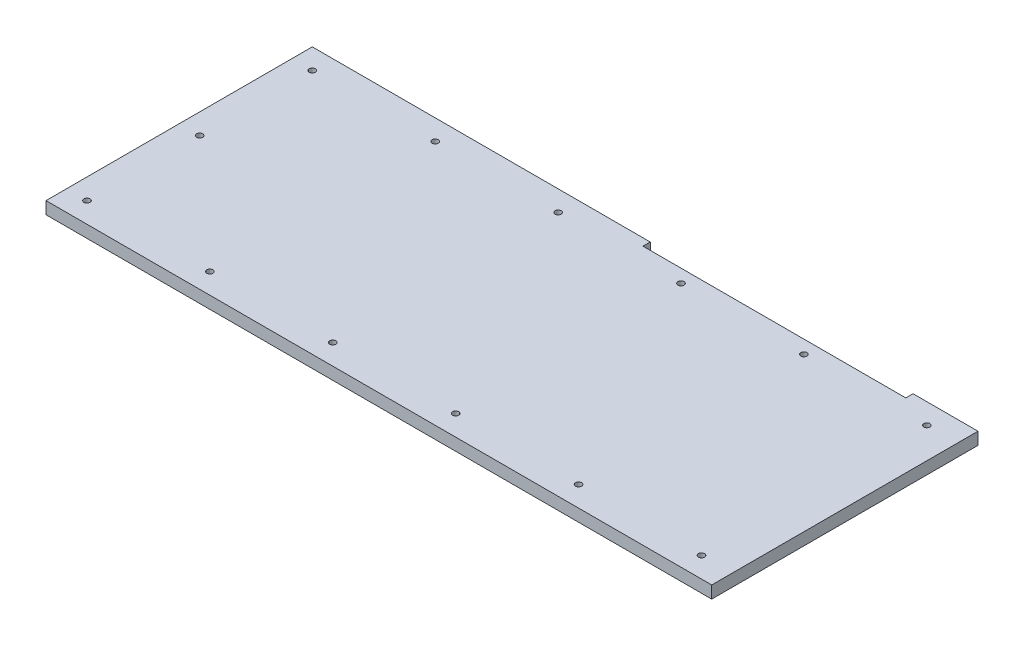
ISO-10303-21;
HEADER;
FILE_DESCRIPTION(('STEP AP214'),'2;1');
FILE_NAME('part.step','',(''),(''),'','','');
FILE_SCHEMA(('AUTOMOTIVE_DESIGN { 1 0 10303 214 1 1 1 1 }'));
ENDSEC;
DATA;
#1=APPLICATION_CONTEXT('core data for automotive mechanical design processes');
#2=APPLICATION_PROTOCOL_DEFINITION('international standard','automotive_design',2000,#1);
#3=PRODUCT_CONTEXT('',#1,'mechanical');
#4=PRODUCT('Part','Part','',(#3));
#5=PRODUCT_RELATED_PRODUCT_CATEGORY('part','',(#4));
#6=PRODUCT_DEFINITION_FORMATION('','',#4);
#7=PRODUCT_DEFINITION_CONTEXT('part definition',#1,'design');
#8=PRODUCT_DEFINITION('design','',#6,#7);
#9=PRODUCT_DEFINITION_SHAPE('','',#8);
#10=(LENGTH_UNIT() NAMED_UNIT(*) SI_UNIT(.MILLI.,.METRE.));
#11=(NAMED_UNIT(*) PLANE_ANGLE_UNIT() SI_UNIT($,.RADIAN.));
#12=(NAMED_UNIT(*) SI_UNIT($,.STERADIAN.) SOLID_ANGLE_UNIT());
#13=UNCERTAINTY_MEASURE_WITH_UNIT(LENGTH_MEASURE(1.E-05),#10,'distance_accuracy_value','');
#14=(GEOMETRIC_REPRESENTATION_CONTEXT(3) GLOBAL_UNCERTAINTY_ASSIGNED_CONTEXT((#13)) GLOBAL_UNIT_ASSIGNED_CONTEXT((#10,
#11,#12)) REPRESENTATION_CONTEXT('',''));
#15=CARTESIAN_POINT('',(0.,0.,0.));
#16=DIRECTION('',(0.,0.,1.));
#17=DIRECTION('',(1.,0.,0.));
#18=AXIS2_PLACEMENT_3D('',#15,#16,#17);
#19=CARTESIAN_POINT('',(0.,6.,0.));
#20=DIRECTION('',(0.,1.,0.));
#21=DIRECTION('',(0.,0.,1.));
#22=AXIS2_PLACEMENT_3D('',#19,#20,#21);
#23=PLANE('',#22);
#24=CARTESIAN_POINT('',(87.5,6.,55.));
#25=DIRECTION('',(0.,1.,0.));
#26=DIRECTION('',(0.,0.,1.));
#27=AXIS2_PLACEMENT_3D('',#24,#25,#26);
#28=CIRCLE('',#27,1.5);
#29=CARTESIAN_POINT('',(87.5,6.,56.5));
#30=VERTEX_POINT('',#29);
#31=EDGE_CURVE('E244',#30,#30,#28,.T.);
#32=ORIENTED_EDGE('',*,*,#31,.F.);
#33=EDGE_LOOP('',(#32));
#34=FACE_BOUND('',#33,.T.);
#35=CARTESIAN_POINT('',(-32.5,6.,55.));
#36=DIRECTION('',(0.,1.,0.));
#37=DIRECTION('',(0.,0.,1.));
#38=AXIS2_PLACEMENT_3D('',#35,#36,#37);
#39=CIRCLE('',#38,1.5);
#40=CARTESIAN_POINT('',(-32.5,6.,56.5));
#41=VERTEX_POINT('',#40);
#42=EDGE_CURVE('E232',#41,#41,#39,.T.);
#43=ORIENTED_EDGE('',*,*,#42,.F.);
#44=EDGE_LOOP('',(#43));
#45=FACE_BOUND('',#44,.T.);
#46=CARTESIAN_POINT('',(-152.5,6.,0.));
#47=DIRECTION('',(0.,1.,0.));
#48=DIRECTION('',(0.,0.,1.));
#49=AXIS2_PLACEMENT_3D('',#46,#47,#48);
#50=CIRCLE('',#49,1.5);
#51=CARTESIAN_POINT('',(-152.5,6.,1.5));
#52=VERTEX_POINT('',#51);
#53=EDGE_CURVE('E220',#52,#52,#50,.T.);
#54=ORIENTED_EDGE('',*,*,#53,.F.);
#55=EDGE_LOOP('',(#54));
#56=FACE_BOUND('',#55,.T.);
#57=CARTESIAN_POINT('',(87.5,6.,-55.));
#58=DIRECTION('',(0.,1.,0.));
#59=DIRECTION('',(0.,0.,1.));
#60=AXIS2_PLACEMENT_3D('',#57,#58,#59);
#61=CIRCLE('',#60,1.5);
#62=CARTESIAN_POINT('',(87.5,6.,-53.5));
#63=VERTEX_POINT('',#62);
#64=EDGE_CURVE('E208',#63,#63,#61,.T.);
#65=ORIENTED_EDGE('',*,*,#64,.F.);
#66=EDGE_LOOP('',(#65));
#67=FACE_BOUND('',#66,.T.);
#68=CARTESIAN_POINT('',(-32.5,6.,-55.));
#69=DIRECTION('',(0.,1.,0.));
#70=DIRECTION('',(0.,0.,1.));
#71=AXIS2_PLACEMENT_3D('',#68,#69,#70);
#72=CIRCLE('',#71,1.5);
#73=CARTESIAN_POINT('',(-32.5,6.,-53.5));
#74=VERTEX_POINT('',#73);
#75=EDGE_CURVE('E196',#74,#74,#72,.T.);
#76=ORIENTED_EDGE('',*,*,#75,.F.);
#77=EDGE_LOOP('',(#76));
#78=FACE_BOUND('',#77,.T.);
#79=CARTESIAN_POINT('',(-152.5,6.,55.));
#80=DIRECTION('',(0.,1.,0.));
#81=DIRECTION('',(0.,0.,1.));
#82=AXIS2_PLACEMENT_3D('',#79,#80,#81);
#83=CIRCLE('',#82,1.5);
#84=CARTESIAN_POINT('',(-152.5,6.,56.5));
#85=VERTEX_POINT('',#84);
#86=EDGE_CURVE('E184',#85,#85,#83,.T.);
#87=ORIENTED_EDGE('',*,*,#86,.F.);
#88=EDGE_LOOP('',(#87));
#89=FACE_BOUND('',#88,.T.);
#90=DIRECTION('',(0.,0.,1.));
#91=VECTOR('',#90,1.);
#92=CARTESIAN_POINT('',(-162.5,6.,-65.));
#93=LINE('',#92,#91);
#94=CARTESIAN_POINT('',(-162.5,6.,-65.));
#95=VERTEX_POINT('',#94);
#96=CARTESIAN_POINT('',(-162.5,6.,65.));
#97=VERTEX_POINT('',#96);
#98=EDGE_CURVE('E147',#95,#97,#93,.T.);
#99=ORIENTED_EDGE('',*,*,#98,.T.);
#100=DIRECTION('',(1.,0.,0.));
#101=VECTOR('',#100,1.);
#102=CARTESIAN_POINT('',(-162.5,6.,65.));
#103=LINE('',#102,#101);
#104=CARTESIAN_POINT('',(162.5,6.,65.));
#105=VERTEX_POINT('',#104);
#106=EDGE_CURVE('E95',#97,#105,#103,.T.);
#107=ORIENTED_EDGE('',*,*,#106,.T.);
#108=DIRECTION('',(0.,0.,-1.));
#109=VECTOR('',#108,1.);
#110=CARTESIAN_POINT('',(162.5,6.,-65.));
#111=LINE('',#110,#109);
#112=CARTESIAN_POINT('',(162.5,6.,-65.));
#113=VERTEX_POINT('',#112);
#114=EDGE_CURVE('E162',#105,#113,#111,.T.);
#115=ORIENTED_EDGE('',*,*,#114,.T.);
#116=DIRECTION('',(-1.,0.,0.));
#117=VECTOR('',#116,1.);
#118=CARTESIAN_POINT('',(130.785768406931,6.,-65.));
#119=LINE('',#118,#117);
#120=CARTESIAN_POINT('',(130.785768406931,6.,-65.));
#121=VERTEX_POINT('',#120);
#122=EDGE_CURVE('E175',#113,#121,#119,.T.);
#123=ORIENTED_EDGE('',*,*,#122,.T.);
#124=DIRECTION('',(0.,0.,1.));
#125=VECTOR('',#124,1.);
#126=CARTESIAN_POINT('',(130.785768406931,6.,-65.));
#127=LINE('',#126,#125);
#128=CARTESIAN_POINT('',(130.785768406931,6.,-61.4546161739281));
#129=VERTEX_POINT('',#128);
#130=EDGE_CURVE('E114',#121,#129,#127,.T.);
#131=ORIENTED_EDGE('',*,*,#130,.T.);
#132=DIRECTION('',(-1.,0.,0.));
#133=VECTOR('',#132,1.);
#134=CARTESIAN_POINT('',(130.785768406931,6.,-61.4546161739281));
#135=LINE('',#134,#133);
#136=CARTESIAN_POINT('',(2.49780314905491,6.,-61.4546161739281));
#137=VERTEX_POINT('',#136);
#138=EDGE_CURVE('E108',#129,#137,#135,.T.);
#139=ORIENTED_EDGE('',*,*,#138,.T.);
#140=DIRECTION('',(0.,0.,-1.));
#141=VECTOR('',#140,1.);
#142=CARTESIAN_POINT('',(2.49780314905491,6.,-61.4546161739281));
#143=LINE('',#142,#141);
#144=CARTESIAN_POINT('',(2.49780314905491,6.,-65.));
#145=VERTEX_POINT('',#144);
#146=EDGE_CURVE('E112',#137,#145,#143,.T.);
#147=ORIENTED_EDGE('',*,*,#146,.T.);
#148=DIRECTION('',(-1.,0.,0.));
#149=VECTOR('',#148,1.);
#150=CARTESIAN_POINT('',(-162.5,6.,-65.));
#151=LINE('',#150,#149);
#152=EDGE_CURVE('E52',#145,#95,#151,.T.);
#153=ORIENTED_EDGE('',*,*,#152,.T.);
#154=EDGE_LOOP('',(#99,#107,#115,#123,#131,#139,#147,#153));
#155=FACE_BOUND('',#154,.T.);
#156=CARTESIAN_POINT('',(-152.5,6.,-55.));
#157=DIRECTION('',(0.,1.,0.));
#158=DIRECTION('',(0.,0.,1.));
#159=AXIS2_PLACEMENT_3D('',#156,#157,#158);
#160=CIRCLE('',#159,1.5);
#161=CARTESIAN_POINT('',(-152.5,6.,-53.5));
#162=VERTEX_POINT('',#161);
#163=EDGE_CURVE('E136',#162,#162,#160,.T.);
#164=ORIENTED_EDGE('',*,*,#163,.F.);
#165=EDGE_LOOP('',(#164));
#166=FACE_BOUND('',#165,.T.);
#167=CARTESIAN_POINT('',(-92.5,6.,-55.));
#168=DIRECTION('',(0.,1.,0.));
#169=DIRECTION('',(0.,0.,1.));
#170=AXIS2_PLACEMENT_3D('',#167,#168,#169);
#171=CIRCLE('',#170,1.5);
#172=CARTESIAN_POINT('',(-92.5,6.,-53.5));
#173=VERTEX_POINT('',#172);
#174=EDGE_CURVE('E190',#173,#173,#171,.T.);
#175=ORIENTED_EDGE('',*,*,#174,.F.);
#176=EDGE_LOOP('',(#175));
#177=FACE_BOUND('',#176,.T.);
#178=CARTESIAN_POINT('',(27.5,6.,-55.));
#179=DIRECTION('',(0.,1.,0.));
#180=DIRECTION('',(0.,0.,1.));
#181=AXIS2_PLACEMENT_3D('',#178,#179,#180);
#182=CIRCLE('',#181,1.5);
#183=CARTESIAN_POINT('',(27.5,6.,-53.5));
#184=VERTEX_POINT('',#183);
#185=EDGE_CURVE('E202',#184,#184,#182,.T.);
#186=ORIENTED_EDGE('',*,*,#185,.F.);
#187=EDGE_LOOP('',(#186));
#188=FACE_BOUND('',#187,.T.);
#189=CARTESIAN_POINT('',(147.5,6.,-55.));
#190=DIRECTION('',(0.,1.,0.));
#191=DIRECTION('',(0.,0.,1.));
#192=AXIS2_PLACEMENT_3D('',#189,#190,#191);
#193=CIRCLE('',#192,1.5);
#194=CARTESIAN_POINT('',(147.5,6.,-53.5));
#195=VERTEX_POINT('',#194);
#196=EDGE_CURVE('E214',#195,#195,#193,.T.);
#197=ORIENTED_EDGE('',*,*,#196,.F.);
#198=EDGE_LOOP('',(#197));
#199=FACE_BOUND('',#198,.T.);
#200=CARTESIAN_POINT('',(-92.5,6.,55.));
#201=DIRECTION('',(0.,1.,0.));
#202=DIRECTION('',(0.,0.,1.));
#203=AXIS2_PLACEMENT_3D('',#200,#201,#202);
#204=CIRCLE('',#203,1.5);
#205=CARTESIAN_POINT('',(-92.5,6.,56.5));
#206=VERTEX_POINT('',#205);
#207=EDGE_CURVE('E226',#206,#206,#204,.T.);
#208=ORIENTED_EDGE('',*,*,#207,.F.);
#209=EDGE_LOOP('',(#208));
#210=FACE_BOUND('',#209,.T.);
#211=CARTESIAN_POINT('',(27.5,6.,55.));
#212=DIRECTION('',(0.,1.,0.));
#213=DIRECTION('',(0.,0.,1.));
#214=AXIS2_PLACEMENT_3D('',#211,#212,#213);
#215=CIRCLE('',#214,1.5);
#216=CARTESIAN_POINT('',(27.5,6.,56.5));
#217=VERTEX_POINT('',#216);
#218=EDGE_CURVE('E238',#217,#217,#215,.T.);
#219=ORIENTED_EDGE('',*,*,#218,.F.);
#220=EDGE_LOOP('',(#219));
#221=FACE_BOUND('',#220,.T.);
#222=CARTESIAN_POINT('',(147.5,6.,55.));
#223=DIRECTION('',(0.,1.,0.));
#224=DIRECTION('',(0.,0.,1.));
#225=AXIS2_PLACEMENT_3D('',#222,#223,#224);
#226=CIRCLE('',#225,1.5);
#227=CARTESIAN_POINT('',(147.5,6.,56.5));
#228=VERTEX_POINT('',#227);
#229=EDGE_CURVE('E250',#228,#228,#226,.T.);
#230=ORIENTED_EDGE('',*,*,#229,.F.);
#231=EDGE_LOOP('',(#230));
#232=FACE_BOUND('',#231,.T.);
#233=ADVANCED_FACE('F35',(#34,#45,#56,#67,#78,#89,#155,#166,#177,#188,#199,#210,#221,#232),#23,.T.);
#234=CARTESIAN_POINT('',(0.,0.,0.));
#235=DIRECTION('',(0.,1.,0.));
#236=DIRECTION('',(0.,0.,1.));
#237=AXIS2_PLACEMENT_3D('',#234,#235,#236);
#238=PLANE('',#237);
#239=DIRECTION('',(0.,0.,1.));
#240=VECTOR('',#239,1.);
#241=CARTESIAN_POINT('',(-162.5,0.,-65.));
#242=LINE('',#241,#240);
#243=CARTESIAN_POINT('',(-162.5,0.,-65.));
#244=VERTEX_POINT('',#243);
#245=CARTESIAN_POINT('',(-162.5,0.,65.));
#246=VERTEX_POINT('',#245);
#247=EDGE_CURVE('E132',#244,#246,#242,.T.);
#248=ORIENTED_EDGE('',*,*,#247,.F.);
#249=DIRECTION('',(-1.,0.,0.));
#250=VECTOR('',#249,1.);
#251=CARTESIAN_POINT('',(-162.5,0.,-65.));
#252=LINE('',#251,#250);
#253=CARTESIAN_POINT('',(2.49780314905491,0.,-65.));
#254=VERTEX_POINT('',#253);
#255=EDGE_CURVE('E87',#254,#244,#252,.T.);
#256=ORIENTED_EDGE('',*,*,#255,.F.);
#257=DIRECTION('',(0.,0.,-1.));
#258=VECTOR('',#257,1.);
#259=CARTESIAN_POINT('',(2.49780314905491,0.,-61.4546161739281));
#260=LINE('',#259,#258);
#261=CARTESIAN_POINT('',(2.49780314905491,0.,-61.4546161739281));
#262=VERTEX_POINT('',#261);
#263=EDGE_CURVE('E81',#262,#254,#260,.T.);
#264=ORIENTED_EDGE('',*,*,#263,.F.);
#265=DIRECTION('',(-1.,0.,0.));
#266=VECTOR('',#265,1.);
#267=CARTESIAN_POINT('',(130.785768406931,0.,-61.4546161739281));
#268=LINE('',#267,#266);
#269=CARTESIAN_POINT('',(130.785768406931,0.,-61.4546161739281));
#270=VERTEX_POINT('',#269);
#271=EDGE_CURVE('E122',#270,#262,#268,.T.);
#272=ORIENTED_EDGE('',*,*,#271,.F.);
#273=DIRECTION('',(0.,0.,1.));
#274=VECTOR('',#273,1.);
#275=CARTESIAN_POINT('',(130.785768406931,0.,-65.));
#276=LINE('',#275,#274);
#277=CARTESIAN_POINT('',(130.785768406931,0.,-65.));
#278=VERTEX_POINT('',#277);
#279=EDGE_CURVE('E142',#278,#270,#276,.T.);
#280=ORIENTED_EDGE('',*,*,#279,.F.);
#281=DIRECTION('',(-1.,0.,0.));
#282=VECTOR('',#281,1.);
#283=CARTESIAN_POINT('',(130.785768406931,0.,-65.));
#284=LINE('',#283,#282);
#285=CARTESIAN_POINT('',(162.5,0.,-65.));
#286=VERTEX_POINT('',#285);
#287=EDGE_CURVE('E140',#286,#278,#284,.T.);
#288=ORIENTED_EDGE('',*,*,#287,.F.);
#289=DIRECTION('',(0.,0.,-1.));
#290=VECTOR('',#289,1.);
#291=CARTESIAN_POINT('',(162.5,0.,-65.));
#292=LINE('',#291,#290);
#293=CARTESIAN_POINT('',(162.5,0.,65.));
#294=VERTEX_POINT('',#293);
#295=EDGE_CURVE('E138',#294,#286,#292,.T.);
#296=ORIENTED_EDGE('',*,*,#295,.F.);
#297=DIRECTION('',(1.,0.,0.));
#298=VECTOR('',#297,1.);
#299=CARTESIAN_POINT('',(-162.5,0.,65.));
#300=LINE('',#299,#298);
#301=EDGE_CURVE('E135',#246,#294,#300,.T.);
#302=ORIENTED_EDGE('',*,*,#301,.F.);
#303=EDGE_LOOP('',(#248,#256,#264,#272,#280,#288,#296,#302));
#304=FACE_BOUND('',#303,.T.);
#305=CARTESIAN_POINT('',(-152.5,0.,-55.));
#306=DIRECTION('',(0.,1.,0.));
#307=DIRECTION('',(0.,0.,1.));
#308=AXIS2_PLACEMENT_3D('',#305,#306,#307);
#309=CIRCLE('',#308,1.5);
#310=CARTESIAN_POINT('',(-152.5,0.,-53.5));
#311=VERTEX_POINT('',#310);
#312=EDGE_CURVE('E181',#311,#311,#309,.T.);
#313=ORIENTED_EDGE('',*,*,#312,.T.);
#314=EDGE_LOOP('',(#313));
#315=FACE_BOUND('',#314,.T.);
#316=CARTESIAN_POINT('',(-152.5,0.,55.));
#317=DIRECTION('',(0.,1.,0.));
#318=DIRECTION('',(0.,0.,1.));
#319=AXIS2_PLACEMENT_3D('',#316,#317,#318);
#320=CIRCLE('',#319,1.5);
#321=CARTESIAN_POINT('',(-152.5,0.,56.5));
#322=VERTEX_POINT('',#321);
#323=EDGE_CURVE('E187',#322,#322,#320,.T.);
#324=ORIENTED_EDGE('',*,*,#323,.T.);
#325=EDGE_LOOP('',(#324));
#326=FACE_BOUND('',#325,.T.);
#327=CARTESIAN_POINT('',(-92.5,0.,-55.));
#328=DIRECTION('',(0.,1.,0.));
#329=DIRECTION('',(0.,0.,1.));
#330=AXIS2_PLACEMENT_3D('',#327,#328,#329);
#331=CIRCLE('',#330,1.5);
#332=CARTESIAN_POINT('',(-92.5,0.,-53.5));
#333=VERTEX_POINT('',#332);
#334=EDGE_CURVE('E193',#333,#333,#331,.T.);
#335=ORIENTED_EDGE('',*,*,#334,.T.);
#336=EDGE_LOOP('',(#335));
#337=FACE_BOUND('',#336,.T.);
#338=CARTESIAN_POINT('',(-32.5,0.,-55.));
#339=DIRECTION('',(0.,1.,0.));
#340=DIRECTION('',(0.,0.,1.));
#341=AXIS2_PLACEMENT_3D('',#338,#339,#340);
#342=CIRCLE('',#341,1.5);
#343=CARTESIAN_POINT('',(-32.5,0.,-53.5));
#344=VERTEX_POINT('',#343);
#345=EDGE_CURVE('E199',#344,#344,#342,.T.);
#346=ORIENTED_EDGE('',*,*,#345,.T.);
#347=EDGE_LOOP('',(#346));
#348=FACE_BOUND('',#347,.T.);
#349=CARTESIAN_POINT('',(27.5,0.,-55.));
#350=DIRECTION('',(0.,1.,0.));
#351=DIRECTION('',(0.,0.,1.));
#352=AXIS2_PLACEMENT_3D('',#349,#350,#351);
#353=CIRCLE('',#352,1.5);
#354=CARTESIAN_POINT('',(27.5,0.,-53.5));
#355=VERTEX_POINT('',#354);
#356=EDGE_CURVE('E205',#355,#355,#353,.T.);
#357=ORIENTED_EDGE('',*,*,#356,.T.);
#358=EDGE_LOOP('',(#357));
#359=FACE_BOUND('',#358,.T.);
#360=CARTESIAN_POINT('',(87.5,0.,-55.));
#361=DIRECTION('',(0.,1.,0.));
#362=DIRECTION('',(0.,0.,1.));
#363=AXIS2_PLACEMENT_3D('',#360,#361,#362);
#364=CIRCLE('',#363,1.5);
#365=CARTESIAN_POINT('',(87.5,0.,-53.5));
#366=VERTEX_POINT('',#365);
#367=EDGE_CURVE('E211',#366,#366,#364,.T.);
#368=ORIENTED_EDGE('',*,*,#367,.T.);
#369=EDGE_LOOP('',(#368));
#370=FACE_BOUND('',#369,.T.);
#371=CARTESIAN_POINT('',(147.5,0.,-55.));
#372=DIRECTION('',(0.,1.,0.));
#373=DIRECTION('',(0.,0.,1.));
#374=AXIS2_PLACEMENT_3D('',#371,#372,#373);
#375=CIRCLE('',#374,1.5);
#376=CARTESIAN_POINT('',(147.5,0.,-53.5));
#377=VERTEX_POINT('',#376);
#378=EDGE_CURVE('E217',#377,#377,#375,.T.);
#379=ORIENTED_EDGE('',*,*,#378,.T.);
#380=EDGE_LOOP('',(#379));
#381=FACE_BOUND('',#380,.T.);
#382=CARTESIAN_POINT('',(-152.5,0.,0.));
#383=DIRECTION('',(0.,1.,0.));
#384=DIRECTION('',(0.,0.,1.));
#385=AXIS2_PLACEMENT_3D('',#382,#383,#384);
#386=CIRCLE('',#385,1.5);
#387=CARTESIAN_POINT('',(-152.5,0.,1.5));
#388=VERTEX_POINT('',#387);
#389=EDGE_CURVE('E223',#388,#388,#386,.T.);
#390=ORIENTED_EDGE('',*,*,#389,.T.);
#391=EDGE_LOOP('',(#390));
#392=FACE_BOUND('',#391,.T.);
#393=CARTESIAN_POINT('',(-92.5,0.,55.));
#394=DIRECTION('',(0.,1.,0.));
#395=DIRECTION('',(0.,0.,1.));
#396=AXIS2_PLACEMENT_3D('',#393,#394,#395);
#397=CIRCLE('',#396,1.5);
#398=CARTESIAN_POINT('',(-92.5,0.,56.5));
#399=VERTEX_POINT('',#398);
#400=EDGE_CURVE('E229',#399,#399,#397,.T.);
#401=ORIENTED_EDGE('',*,*,#400,.T.);
#402=EDGE_LOOP('',(#401));
#403=FACE_BOUND('',#402,.T.);
#404=CARTESIAN_POINT('',(-32.5,0.,55.));
#405=DIRECTION('',(0.,1.,0.));
#406=DIRECTION('',(0.,0.,1.));
#407=AXIS2_PLACEMENT_3D('',#404,#405,#406);
#408=CIRCLE('',#407,1.5);
#409=CARTESIAN_POINT('',(-32.5,0.,56.5));
#410=VERTEX_POINT('',#409);
#411=EDGE_CURVE('E235',#410,#410,#408,.T.);
#412=ORIENTED_EDGE('',*,*,#411,.T.);
#413=EDGE_LOOP('',(#412));
#414=FACE_BOUND('',#413,.T.);
#415=CARTESIAN_POINT('',(27.5,0.,55.));
#416=DIRECTION('',(0.,1.,0.));
#417=DIRECTION('',(0.,0.,1.));
#418=AXIS2_PLACEMENT_3D('',#415,#416,#417);
#419=CIRCLE('',#418,1.5);
#420=CARTESIAN_POINT('',(27.5,0.,56.5));
#421=VERTEX_POINT('',#420);
#422=EDGE_CURVE('E241',#421,#421,#419,.T.);
#423=ORIENTED_EDGE('',*,*,#422,.T.);
#424=EDGE_LOOP('',(#423));
#425=FACE_BOUND('',#424,.T.);
#426=CARTESIAN_POINT('',(87.5,0.,55.));
#427=DIRECTION('',(0.,1.,0.));
#428=DIRECTION('',(0.,0.,1.));
#429=AXIS2_PLACEMENT_3D('',#426,#427,#428);
#430=CIRCLE('',#429,1.5);
#431=CARTESIAN_POINT('',(87.5,0.,56.5));
#432=VERTEX_POINT('',#431);
#433=EDGE_CURVE('E247',#432,#432,#430,.T.);
#434=ORIENTED_EDGE('',*,*,#433,.T.);
#435=EDGE_LOOP('',(#434));
#436=FACE_BOUND('',#435,.T.);
#437=CARTESIAN_POINT('',(147.5,0.,55.));
#438=DIRECTION('',(0.,1.,0.));
#439=DIRECTION('',(0.,0.,1.));
#440=AXIS2_PLACEMENT_3D('',#437,#438,#439);
#441=CIRCLE('',#440,1.5);
#442=CARTESIAN_POINT('',(147.5,0.,56.5));
#443=VERTEX_POINT('',#442);
#444=EDGE_CURVE('E253',#443,#443,#441,.T.);
#445=ORIENTED_EDGE('',*,*,#444,.T.);
#446=EDGE_LOOP('',(#445));
#447=FACE_BOUND('',#446,.T.);
#448=ADVANCED_FACE('F166',(#304,#315,#326,#337,#348,#359,#370,#381,#392,#403,#414,#425,#436,
#447),#238,.F.);
#449=CARTESIAN_POINT('',(-162.5,6.,-65.));
#450=DIRECTION('',(1.,0.,0.));
#451=DIRECTION('',(0.,0.,-1.));
#452=AXIS2_PLACEMENT_3D('',#449,#450,#451);
#453=PLANE('',#452);
#454=ORIENTED_EDGE('',*,*,#247,.T.);
#455=DIRECTION('',(0.,-1.,0.));
#456=VECTOR('',#455,1.);
#457=CARTESIAN_POINT('',(-162.5,6.,65.));
#458=LINE('',#457,#456);
#459=EDGE_CURVE('E11',#97,#246,#458,.T.);
#460=ORIENTED_EDGE('',*,*,#459,.F.);
#461=ORIENTED_EDGE('',*,*,#98,.F.);
#462=DIRECTION('',(0.,-1.,0.));
#463=VECTOR('',#462,1.);
#464=CARTESIAN_POINT('',(-162.5,6.,-65.));
#465=LINE('',#464,#463);
#466=EDGE_CURVE('E128',#95,#244,#465,.T.);
#467=ORIENTED_EDGE('',*,*,#466,.T.);
#468=EDGE_LOOP('',(#454,#460,#461,#467));
#469=FACE_BOUND('',#468,.T.);
#470=ADVANCED_FACE('F37',(#469),#453,.F.);
#471=CARTESIAN_POINT('',(-162.5,6.,65.));
#472=DIRECTION('',(0.,0.,-1.));
#473=DIRECTION('',(-1.,0.,0.));
#474=AXIS2_PLACEMENT_3D('',#471,#472,#473);
#475=PLANE('',#474);
#476=ORIENTED_EDGE('',*,*,#301,.T.);
#477=DIRECTION('',(0.,-1.,0.));
#478=VECTOR('',#477,1.);
#479=CARTESIAN_POINT('',(162.5,6.,65.));
#480=LINE('',#479,#478);
#481=EDGE_CURVE('E44',#105,#294,#480,.T.);
#482=ORIENTED_EDGE('',*,*,#481,.F.);
#483=ORIENTED_EDGE('',*,*,#106,.F.);
#484=ORIENTED_EDGE('',*,*,#459,.T.);
#485=EDGE_LOOP('',(#476,#482,#483,#484));
#486=FACE_BOUND('',#485,.T.);
#487=ADVANCED_FACE('F287',(#486),#475,.F.);
#488=CARTESIAN_POINT('',(162.5,6.,-65.));
#489=DIRECTION('',(-1.,0.,0.));
#490=DIRECTION('',(0.,0.,1.));
#491=AXIS2_PLACEMENT_3D('',#488,#489,#490);
#492=PLANE('',#491);
#493=ORIENTED_EDGE('',*,*,#295,.T.);
#494=DIRECTION('',(0.,-1.,0.));
#495=VECTOR('',#494,1.);
#496=CARTESIAN_POINT('',(162.5,6.,-65.));
#497=LINE('',#496,#495);
#498=EDGE_CURVE('E154',#113,#286,#497,.T.);
#499=ORIENTED_EDGE('',*,*,#498,.F.);
#500=ORIENTED_EDGE('',*,*,#114,.F.);
#501=ORIENTED_EDGE('',*,*,#481,.T.);
#502=EDGE_LOOP('',(#493,#499,#500,#501));
#503=FACE_BOUND('',#502,.T.);
#504=ADVANCED_FACE('F160',(#503),#492,.F.);
#505=CARTESIAN_POINT('',(130.785768406931,6.,-65.));
#506=DIRECTION('',(0.,0.,1.));
#507=DIRECTION('',(1.,0.,0.));
#508=AXIS2_PLACEMENT_3D('',#505,#506,#507);
#509=PLANE('',#508);
#510=ORIENTED_EDGE('',*,*,#287,.T.);
#511=DIRECTION('',(0.,-1.,0.));
#512=VECTOR('',#511,1.);
#513=CARTESIAN_POINT('',(130.785768406931,6.,-65.));
#514=LINE('',#513,#512);
#515=EDGE_CURVE('E151',#121,#278,#514,.T.);
#516=ORIENTED_EDGE('',*,*,#515,.F.);
#517=ORIENTED_EDGE('',*,*,#122,.F.);
#518=ORIENTED_EDGE('',*,*,#498,.T.);
#519=EDGE_LOOP('',(#510,#516,#517,#518));
#520=FACE_BOUND('',#519,.T.);
#521=ADVANCED_FACE('F171',(#520),#509,.F.);
#522=CARTESIAN_POINT('',(130.785768406931,6.,-65.));
#523=DIRECTION('',(1.,0.,0.));
#524=DIRECTION('',(0.,0.,-1.));
#525=AXIS2_PLACEMENT_3D('',#522,#523,#524);
#526=PLANE('',#525);
#527=ORIENTED_EDGE('',*,*,#279,.T.);
#528=DIRECTION('',(0.,-1.,0.));
#529=VECTOR('',#528,1.);
#530=CARTESIAN_POINT('',(130.785768406931,6.,-61.4546161739281));
#531=LINE('',#530,#529);
#532=EDGE_CURVE('E123',#129,#270,#531,.T.);
#533=ORIENTED_EDGE('',*,*,#532,.F.);
#534=ORIENTED_EDGE('',*,*,#130,.F.);
#535=ORIENTED_EDGE('',*,*,#515,.T.);
#536=EDGE_LOOP('',(#527,#533,#534,#535));
#537=FACE_BOUND('',#536,.T.);
#538=ADVANCED_FACE('F174',(#537),#526,.F.);
#539=CARTESIAN_POINT('',(130.785768406931,6.,-61.4546161739281));
#540=DIRECTION('',(0.,0.,1.));
#541=DIRECTION('',(1.,0.,0.));
#542=AXIS2_PLACEMENT_3D('',#539,#540,#541);
#543=PLANE('',#542);
#544=ORIENTED_EDGE('',*,*,#271,.T.);
#545=DIRECTION('',(0.,-1.,0.));
#546=VECTOR('',#545,1.);
#547=CARTESIAN_POINT('',(2.49780314905491,6.,-61.4546161739281));
#548=LINE('',#547,#546);
#549=EDGE_CURVE('E119',#137,#262,#548,.T.);
#550=ORIENTED_EDGE('',*,*,#549,.F.);
#551=ORIENTED_EDGE('',*,*,#138,.F.);
#552=ORIENTED_EDGE('',*,*,#532,.T.);
#553=EDGE_LOOP('',(#544,#550,#551,#552));
#554=FACE_BOUND('',#553,.T.);
#555=ADVANCED_FACE('F120',(#554),#543,.F.);
#556=CARTESIAN_POINT('',(2.49780314905491,6.,-61.4546161739281));
#557=DIRECTION('',(-1.,0.,0.));
#558=DIRECTION('',(0.,0.,1.));
#559=AXIS2_PLACEMENT_3D('',#556,#557,#558);
#560=PLANE('',#559);
#561=ORIENTED_EDGE('',*,*,#263,.T.);
#562=DIRECTION('',(0.,-1.,0.));
#563=VECTOR('',#562,1.);
#564=CARTESIAN_POINT('',(2.49780314905491,6.,-65.));
#565=LINE('',#564,#563);
#566=EDGE_CURVE('E124',#145,#254,#565,.T.);
#567=ORIENTED_EDGE('',*,*,#566,.F.);
#568=ORIENTED_EDGE('',*,*,#146,.F.);
#569=ORIENTED_EDGE('',*,*,#549,.T.);
#570=EDGE_LOOP('',(#561,#567,#568,#569));
#571=FACE_BOUND('',#570,.T.);
#572=ADVANCED_FACE('F126',(#571),#560,.F.);
#573=CARTESIAN_POINT('',(-162.5,6.,-65.));
#574=DIRECTION('',(0.,0.,1.));
#575=DIRECTION('',(1.,0.,0.));
#576=AXIS2_PLACEMENT_3D('',#573,#574,#575);
#577=PLANE('',#576);
#578=ORIENTED_EDGE('',*,*,#255,.T.);
#579=ORIENTED_EDGE('',*,*,#466,.F.);
#580=ORIENTED_EDGE('',*,*,#152,.F.);
#581=ORIENTED_EDGE('',*,*,#566,.T.);
#582=EDGE_LOOP('',(#578,#579,#580,#581));
#583=FACE_BOUND('',#582,.T.);
#584=ADVANCED_FACE('F275',(#583),#577,.F.);
#585=CARTESIAN_POINT('',(-152.5,6.,-55.));
#586=DIRECTION('',(0.,-1.,0.));
#587=DIRECTION('',(0.,0.,-1.));
#588=AXIS2_PLACEMENT_3D('',#585,#586,#587);
#589=CYLINDRICAL_SURFACE('',#588,1.5);
#590=ORIENTED_EDGE('',*,*,#163,.T.);
#591=EDGE_LOOP('',(#590));
#592=FACE_BOUND('',#591,.T.);
#593=ORIENTED_EDGE('',*,*,#312,.F.);
#594=EDGE_LOOP('',(#593));
#595=FACE_BOUND('',#594,.T.);
#596=ADVANCED_FACE('F272',(#592,#595),#589,.F.);
#597=CARTESIAN_POINT('',(-152.5,6.,55.));
#598=DIRECTION('',(0.,-1.,0.));
#599=DIRECTION('',(0.,0.,-1.));
#600=AXIS2_PLACEMENT_3D('',#597,#598,#599);
#601=CYLINDRICAL_SURFACE('',#600,1.5);
#602=ORIENTED_EDGE('',*,*,#86,.T.);
#603=EDGE_LOOP('',(#602));
#604=FACE_BOUND('',#603,.T.);
#605=ORIENTED_EDGE('',*,*,#323,.F.);
#606=EDGE_LOOP('',(#605));
#607=FACE_BOUND('',#606,.T.);
#608=ADVANCED_FACE('F351',(#604,#607),#601,.F.);
#609=CARTESIAN_POINT('',(-92.5,6.,-55.));
#610=DIRECTION('',(0.,-1.,0.));
#611=DIRECTION('',(0.,0.,-1.));
#612=AXIS2_PLACEMENT_3D('',#609,#610,#611);
#613=CYLINDRICAL_SURFACE('',#612,1.5);
#614=ORIENTED_EDGE('',*,*,#174,.T.);
#615=EDGE_LOOP('',(#614));
#616=FACE_BOUND('',#615,.T.);
#617=ORIENTED_EDGE('',*,*,#334,.F.);
#618=EDGE_LOOP('',(#617));
#619=FACE_BOUND('',#618,.T.);
#620=ADVANCED_FACE('F359',(#616,#619),#613,.F.);
#621=CARTESIAN_POINT('',(-32.5,6.,-55.));
#622=DIRECTION('',(0.,-1.,0.));
#623=DIRECTION('',(0.,0.,-1.));
#624=AXIS2_PLACEMENT_3D('',#621,#622,#623);
#625=CYLINDRICAL_SURFACE('',#624,1.5);
#626=ORIENTED_EDGE('',*,*,#75,.T.);
#627=EDGE_LOOP('',(#626));
#628=FACE_BOUND('',#627,.T.);
#629=ORIENTED_EDGE('',*,*,#345,.F.);
#630=EDGE_LOOP('',(#629));
#631=FACE_BOUND('',#630,.T.);
#632=ADVANCED_FACE('F367',(#628,#631),#625,.F.);
#633=CARTESIAN_POINT('',(27.5,6.,-55.));
#634=DIRECTION('',(0.,-1.,0.));
#635=DIRECTION('',(0.,0.,-1.));
#636=AXIS2_PLACEMENT_3D('',#633,#634,#635);
#637=CYLINDRICAL_SURFACE('',#636,1.5);
#638=ORIENTED_EDGE('',*,*,#185,.T.);
#639=EDGE_LOOP('',(#638));
#640=FACE_BOUND('',#639,.T.);
#641=ORIENTED_EDGE('',*,*,#356,.F.);
#642=EDGE_LOOP('',(#641));
#643=FACE_BOUND('',#642,.T.);
#644=ADVANCED_FACE('F376',(#640,#643),#637,.F.);
#645=CARTESIAN_POINT('',(87.5,6.,-55.));
#646=DIRECTION('',(0.,-1.,0.));
#647=DIRECTION('',(0.,0.,-1.));
#648=AXIS2_PLACEMENT_3D('',#645,#646,#647);
#649=CYLINDRICAL_SURFACE('',#648,1.5);
#650=ORIENTED_EDGE('',*,*,#64,.T.);
#651=EDGE_LOOP('',(#650));
#652=FACE_BOUND('',#651,.T.);
#653=ORIENTED_EDGE('',*,*,#367,.F.);
#654=EDGE_LOOP('',(#653));
#655=FACE_BOUND('',#654,.T.);
#656=ADVANCED_FACE('F385',(#652,#655),#649,.F.);
#657=CARTESIAN_POINT('',(147.5,6.,-55.));
#658=DIRECTION('',(0.,-1.,0.));
#659=DIRECTION('',(0.,0.,-1.));
#660=AXIS2_PLACEMENT_3D('',#657,#658,#659);
#661=CYLINDRICAL_SURFACE('',#660,1.5);
#662=ORIENTED_EDGE('',*,*,#196,.T.);
#663=EDGE_LOOP('',(#662));
#664=FACE_BOUND('',#663,.T.);
#665=ORIENTED_EDGE('',*,*,#378,.F.);
#666=EDGE_LOOP('',(#665));
#667=FACE_BOUND('',#666,.T.);
#668=ADVANCED_FACE('F394',(#664,#667),#661,.F.);
#669=CARTESIAN_POINT('',(-152.5,6.,0.));
#670=DIRECTION('',(0.,-1.,0.));
#671=DIRECTION('',(0.,0.,-1.));
#672=AXIS2_PLACEMENT_3D('',#669,#670,#671);
#673=CYLINDRICAL_SURFACE('',#672,1.5);
#674=ORIENTED_EDGE('',*,*,#53,.T.);
#675=EDGE_LOOP('',(#674));
#676=FACE_BOUND('',#675,.T.);
#677=ORIENTED_EDGE('',*,*,#389,.F.);
#678=EDGE_LOOP('',(#677));
#679=FACE_BOUND('',#678,.T.);
#680=ADVANCED_FACE('F403',(#676,#679),#673,.F.);
#681=CARTESIAN_POINT('',(-92.5,6.,55.));
#682=DIRECTION('',(0.,-1.,0.));
#683=DIRECTION('',(0.,0.,-1.));
#684=AXIS2_PLACEMENT_3D('',#681,#682,#683);
#685=CYLINDRICAL_SURFACE('',#684,1.5);
#686=ORIENTED_EDGE('',*,*,#207,.T.);
#687=EDGE_LOOP('',(#686));
#688=FACE_BOUND('',#687,.T.);
#689=ORIENTED_EDGE('',*,*,#400,.F.);
#690=EDGE_LOOP('',(#689));
#691=FACE_BOUND('',#690,.T.);
#692=ADVANCED_FACE('F412',(#688,#691),#685,.F.);
#693=CARTESIAN_POINT('',(-32.5,6.,55.));
#694=DIRECTION('',(0.,-1.,0.));
#695=DIRECTION('',(0.,0.,-1.));
#696=AXIS2_PLACEMENT_3D('',#693,#694,#695);
#697=CYLINDRICAL_SURFACE('',#696,1.5);
#698=ORIENTED_EDGE('',*,*,#42,.T.);
#699=EDGE_LOOP('',(#698));
#700=FACE_BOUND('',#699,.T.);
#701=ORIENTED_EDGE('',*,*,#411,.F.);
#702=EDGE_LOOP('',(#701));
#703=FACE_BOUND('',#702,.T.);
#704=ADVANCED_FACE('F421',(#700,#703),#697,.F.);
#705=CARTESIAN_POINT('',(27.5,6.,55.));
#706=DIRECTION('',(0.,-1.,0.));
#707=DIRECTION('',(0.,0.,-1.));
#708=AXIS2_PLACEMENT_3D('',#705,#706,#707);
#709=CYLINDRICAL_SURFACE('',#708,1.5);
#710=ORIENTED_EDGE('',*,*,#218,.T.);
#711=EDGE_LOOP('',(#710));
#712=FACE_BOUND('',#711,.T.);
#713=ORIENTED_EDGE('',*,*,#422,.F.);
#714=EDGE_LOOP('',(#713));
#715=FACE_BOUND('',#714,.T.);
#716=ADVANCED_FACE('F430',(#712,#715),#709,.F.);
#717=CARTESIAN_POINT('',(87.5,6.,55.));
#718=DIRECTION('',(0.,-1.,0.));
#719=DIRECTION('',(0.,0.,-1.));
#720=AXIS2_PLACEMENT_3D('',#717,#718,#719);
#721=CYLINDRICAL_SURFACE('',#720,1.5);
#722=ORIENTED_EDGE('',*,*,#31,.T.);
#723=EDGE_LOOP('',(#722));
#724=FACE_BOUND('',#723,.T.);
#725=ORIENTED_EDGE('',*,*,#433,.F.);
#726=EDGE_LOOP('',(#725));
#727=FACE_BOUND('',#726,.T.);
#728=ADVANCED_FACE('F439',(#724,#727),#721,.F.);
#729=CARTESIAN_POINT('',(147.5,6.,55.));
#730=DIRECTION('',(0.,-1.,0.));
#731=DIRECTION('',(0.,0.,-1.));
#732=AXIS2_PLACEMENT_3D('',#729,#730,#731);
#733=CYLINDRICAL_SURFACE('',#732,1.5);
#734=ORIENTED_EDGE('',*,*,#229,.T.);
#735=EDGE_LOOP('',(#734));
#736=FACE_BOUND('',#735,.T.);
#737=ORIENTED_EDGE('',*,*,#444,.F.);
#738=EDGE_LOOP('',(#737));
#739=FACE_BOUND('',#738,.T.);
#740=ADVANCED_FACE('F259',(#736,#739),#733,.F.);
#741=CLOSED_SHELL('',(#233,#448,#470,#487,#504,#521,#538,#555,#572,#584,#596,#608,#620,#632,
#644,#656,#668,#680,#692,#704,#716,#728,#740));
#742=MANIFOLD_SOLID_BREP('B2',#741);
#743=ADVANCED_BREP_SHAPE_REPRESENTATION('',(#18,#742),#14);
#744=SHAPE_DEFINITION_REPRESENTATION(#9,#743);
ENDSEC;
END-ISO-10303-21;
